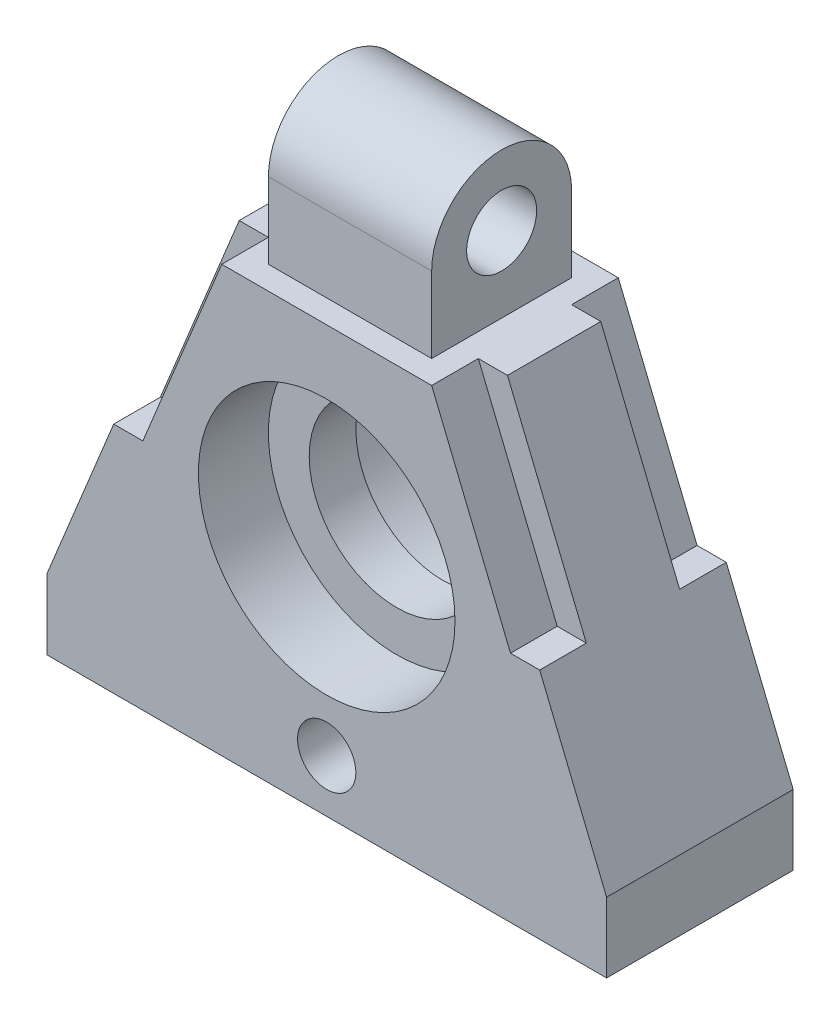
ISO-10303-21;
HEADER;
FILE_DESCRIPTION(('STEP AP214'),'2;1');
FILE_NAME('part.step','',(''),(''),'','','');
FILE_SCHEMA(('AUTOMOTIVE_DESIGN { 1 0 10303 214 1 1 1 1 }'));
ENDSEC;
DATA;
#1=APPLICATION_CONTEXT('core data for automotive mechanical design processes');
#2=APPLICATION_PROTOCOL_DEFINITION('international standard','automotive_design',2000,#1);
#3=PRODUCT_CONTEXT('',#1,'mechanical');
#4=PRODUCT('Part','Part','',(#3));
#5=PRODUCT_RELATED_PRODUCT_CATEGORY('part','',(#4));
#6=PRODUCT_DEFINITION_FORMATION('','',#4);
#7=PRODUCT_DEFINITION_CONTEXT('part definition',#1,'design');
#8=PRODUCT_DEFINITION('design','',#6,#7);
#9=PRODUCT_DEFINITION_SHAPE('','',#8);
#10=(LENGTH_UNIT() NAMED_UNIT(*) SI_UNIT(.MILLI.,.METRE.));
#11=(NAMED_UNIT(*) PLANE_ANGLE_UNIT() SI_UNIT($,.RADIAN.));
#12=(NAMED_UNIT(*) SI_UNIT($,.STERADIAN.) SOLID_ANGLE_UNIT());
#13=UNCERTAINTY_MEASURE_WITH_UNIT(LENGTH_MEASURE(1.E-05),#10,'distance_accuracy_value','');
#14=(GEOMETRIC_REPRESENTATION_CONTEXT(3) GLOBAL_UNCERTAINTY_ASSIGNED_CONTEXT((#13)) GLOBAL_UNIT_ASSIGNED_CONTEXT((#10,
#11,#12)) REPRESENTATION_CONTEXT('',''));
#15=CARTESIAN_POINT('',(0.,0.,0.));
#16=DIRECTION('',(0.,0.,1.));
#17=DIRECTION('',(1.,0.,0.));
#18=AXIS2_PLACEMENT_3D('',#15,#16,#17);
#19=CARTESIAN_POINT('',(-23.,73.,16.));
#20=DIRECTION('',(0.,-1.,0.));
#21=DIRECTION('',(0.,0.,-1.));
#22=AXIS2_PLACEMENT_3D('',#19,#20,#21);
#23=PLANE('',#22);
#24=DIRECTION('',(0.,0.,-1.));
#25=VECTOR('',#24,1.);
#26=CARTESIAN_POINT('',(-18.,73.,-8.));
#27=LINE('',#26,#25);
#28=CARTESIAN_POINT('',(-18.,73.,-8.));
#29=VERTEX_POINT('',#28);
#30=CARTESIAN_POINT('',(-18.,73.,-16.));
#31=VERTEX_POINT('',#30);
#32=EDGE_CURVE('E236',#29,#31,#27,.T.);
#33=ORIENTED_EDGE('',*,*,#32,.F.);
#34=DIRECTION('',(-1.,0.,0.));
#35=VECTOR('',#34,1.);
#36=CARTESIAN_POINT('',(-18.,73.,-8.));
#37=LINE('',#36,#35);
#38=CARTESIAN_POINT('',(-23.,73.,-8.));
#39=VERTEX_POINT('',#38);
#40=EDGE_CURVE('E228',#29,#39,#37,.T.);
#41=ORIENTED_EDGE('',*,*,#40,.T.);
#42=DIRECTION('',(0.,0.,-1.));
#43=VECTOR('',#42,1.);
#44=CARTESIAN_POINT('',(-23.,73.,16.));
#45=LINE('',#44,#43);
#46=CARTESIAN_POINT('',(-23.,73.,8.));
#47=VERTEX_POINT('',#46);
#48=EDGE_CURVE('E349',#47,#39,#45,.T.);
#49=ORIENTED_EDGE('',*,*,#48,.F.);
#50=DIRECTION('',(-1.,0.,0.));
#51=VECTOR('',#50,1.);
#52=CARTESIAN_POINT('',(-18.,73.,8.));
#53=LINE('',#52,#51);
#54=CARTESIAN_POINT('',(-18.,73.,8.));
#55=VERTEX_POINT('',#54);
#56=EDGE_CURVE('E277',#55,#47,#53,.T.);
#57=ORIENTED_EDGE('',*,*,#56,.F.);
#58=DIRECTION('',(0.,0.,1.));
#59=VECTOR('',#58,1.);
#60=CARTESIAN_POINT('',(-18.,73.,8.));
#61=LINE('',#60,#59);
#62=CARTESIAN_POINT('',(-18.,73.,16.));
#63=VERTEX_POINT('',#62);
#64=EDGE_CURVE('E285',#55,#63,#61,.T.);
#65=ORIENTED_EDGE('',*,*,#64,.T.);
#66=DIRECTION('',(-1.,0.,0.));
#67=VECTOR('',#66,1.);
#68=CARTESIAN_POINT('',(-23.,73.,16.));
#69=LINE('',#68,#67);
#70=CARTESIAN_POINT('',(18.,73.,16.));
#71=VERTEX_POINT('',#70);
#72=EDGE_CURVE('E346',#71,#63,#69,.T.);
#73=ORIENTED_EDGE('',*,*,#72,.F.);
#74=DIRECTION('',(0.,0.,1.));
#75=VECTOR('',#74,1.);
#76=CARTESIAN_POINT('',(18.,73.,8.));
#77=LINE('',#76,#75);
#78=CARTESIAN_POINT('',(18.,73.,8.));
#79=VERTEX_POINT('',#78);
#80=EDGE_CURVE('E308',#79,#71,#77,.T.);
#81=ORIENTED_EDGE('',*,*,#80,.F.);
#82=DIRECTION('',(-1.,0.,0.));
#83=VECTOR('',#82,1.);
#84=CARTESIAN_POINT('',(18.,73.,8.));
#85=LINE('',#84,#83);
#86=CARTESIAN_POINT('',(23.,73.,8.));
#87=VERTEX_POINT('',#86);
#88=EDGE_CURVE('E296',#87,#79,#85,.T.);
#89=ORIENTED_EDGE('',*,*,#88,.F.);
#90=DIRECTION('',(0.,0.,-1.));
#91=VECTOR('',#90,1.);
#92=CARTESIAN_POINT('',(23.,73.,16.));
#93=LINE('',#92,#91);
#94=CARTESIAN_POINT('',(23.,73.,-8.));
#95=VERTEX_POINT('',#94);
#96=EDGE_CURVE('E364',#87,#95,#93,.T.);
#97=ORIENTED_EDGE('',*,*,#96,.T.);
#98=DIRECTION('',(-1.,0.,0.));
#99=VECTOR('',#98,1.);
#100=CARTESIAN_POINT('',(18.,73.,-8.));
#101=LINE('',#100,#99);
#102=CARTESIAN_POINT('',(18.,73.,-8.));
#103=VERTEX_POINT('',#102);
#104=EDGE_CURVE('E243',#95,#103,#101,.T.);
#105=ORIENTED_EDGE('',*,*,#104,.T.);
#106=DIRECTION('',(0.,0.,-1.));
#107=VECTOR('',#106,1.);
#108=CARTESIAN_POINT('',(18.,73.,-8.));
#109=LINE('',#108,#107);
#110=CARTESIAN_POINT('',(18.,73.,-16.));
#111=VERTEX_POINT('',#110);
#112=EDGE_CURVE('E259',#103,#111,#109,.T.);
#113=ORIENTED_EDGE('',*,*,#112,.T.);
#114=DIRECTION('',(-1.,0.,0.));
#115=VECTOR('',#114,1.);
#116=CARTESIAN_POINT('',(-23.,73.,-16.));
#117=LINE('',#116,#115);
#118=EDGE_CURVE('E337',#111,#31,#117,.T.);
#119=ORIENTED_EDGE('',*,*,#118,.T.);
#120=EDGE_LOOP('',(#33,#41,#49,#57,#65,#73,#81,#89,#97,#105,#113,#119));
#121=FACE_BOUND('',#120,.T.);
#122=DIRECTION('',(-1.,0.,0.));
#123=VECTOR('',#122,1.);
#124=CARTESIAN_POINT('',(14.,73.,12.));
#125=LINE('',#124,#123);
#126=CARTESIAN_POINT('',(14.,73.,12.));
#127=VERTEX_POINT('',#126);
#128=CARTESIAN_POINT('',(-14.,73.,12.));
#129=VERTEX_POINT('',#128);
#130=EDGE_CURVE('E52',#127,#129,#125,.T.);
#131=ORIENTED_EDGE('',*,*,#130,.T.);
#132=DIRECTION('',(0.,0.,-1.));
#133=VECTOR('',#132,1.);
#134=CARTESIAN_POINT('',(-14.,73.,12.));
#135=LINE('',#134,#133);
#136=CARTESIAN_POINT('',(-14.,73.,-12.));
#137=VERTEX_POINT('',#136);
#138=EDGE_CURVE('E209',#129,#137,#135,.T.);
#139=ORIENTED_EDGE('',*,*,#138,.T.);
#140=DIRECTION('',(-1.,0.,0.));
#141=VECTOR('',#140,1.);
#142=CARTESIAN_POINT('',(14.,73.,-12.));
#143=LINE('',#142,#141);
#144=CARTESIAN_POINT('',(14.,73.,-12.));
#145=VERTEX_POINT('',#144);
#146=EDGE_CURVE('E196',#145,#137,#143,.T.);
#147=ORIENTED_EDGE('',*,*,#146,.F.);
#148=DIRECTION('',(0.,0.,-1.));
#149=VECTOR('',#148,1.);
#150=CARTESIAN_POINT('',(14.,73.,12.));
#151=LINE('',#150,#149);
#152=EDGE_CURVE('E47',#127,#145,#151,.T.);
#153=ORIENTED_EDGE('',*,*,#152,.F.);
#154=EDGE_LOOP('',(#131,#139,#147,#153));
#155=FACE_BOUND('',#154,.T.);
#156=ADVANCED_FACE('F32',(#121,#155),#23,.F.);
#157=CARTESIAN_POINT('',(0.,0.,-16.));
#158=DIRECTION('',(0.,0.,-1.));
#159=DIRECTION('',(-1.,0.,0.));
#160=AXIS2_PLACEMENT_3D('',#157,#158,#159);
#161=PLANE('',#160);
#162=CARTESIAN_POINT('',(0.,8.99999999999999,-16.));
#163=DIRECTION('',(0.,0.,1.));
#164=DIRECTION('',(1.,0.,0.));
#165=AXIS2_PLACEMENT_3D('',#162,#163,#164);
#166=CIRCLE('',#165,5.00000000000002);
#167=CARTESIAN_POINT('',(5.00000000000002,8.99999999999999,-16.));
#168=VERTEX_POINT('',#167);
#169=EDGE_CURVE('E325',#168,#168,#166,.T.);
#170=ORIENTED_EDGE('',*,*,#169,.T.);
#171=EDGE_LOOP('',(#170));
#172=FACE_BOUND('',#171,.T.);
#173=CARTESIAN_POINT('',(0.,40.,-16.));
#174=DIRECTION('',(0.,0.,1.));
#175=DIRECTION('',(1.,0.,0.));
#176=AXIS2_PLACEMENT_3D('',#173,#174,#175);
#177=CIRCLE('',#176,22.);
#178=CARTESIAN_POINT('',(22.,40.,-16.));
#179=VERTEX_POINT('',#178);
#180=EDGE_CURVE('E268',#179,#179,#177,.T.);
#181=ORIENTED_EDGE('',*,*,#180,.T.);
#182=EDGE_LOOP('',(#181));
#183=FACE_BOUND('',#182,.T.);
#184=DIRECTION('',(1.,0.,0.));
#185=VECTOR('',#184,1.);
#186=CARTESIAN_POINT('',(-36.5245901639344,40.,-16.));
#187=LINE('',#186,#185);
#188=CARTESIAN_POINT('',(-36.5245901639344,40.,-16.));
#189=VERTEX_POINT('',#188);
#190=CARTESIAN_POINT('',(-31.5245901639344,40.,-16.));
#191=VERTEX_POINT('',#190);
#192=EDGE_CURVE('E223',#189,#191,#187,.T.);
#193=ORIENTED_EDGE('',*,*,#192,.T.);
#194=DIRECTION('',(0.379223417483882,0.925305138660672,0.));
#195=VECTOR('',#194,1.);
#196=CARTESIAN_POINT('',(-31.5245901639344,40.,-16.));
#197=LINE('',#196,#195);
#198=EDGE_CURVE('E218',#191,#31,#197,.T.);
#199=ORIENTED_EDGE('',*,*,#198,.T.);
#200=ORIENTED_EDGE('',*,*,#118,.F.);
#201=DIRECTION('',(0.379223417483882,-0.925305138660672,0.));
#202=VECTOR('',#201,1.);
#203=CARTESIAN_POINT('',(31.5245901639344,40.,-16.));
#204=LINE('',#203,#202);
#205=CARTESIAN_POINT('',(31.5245901639344,40.,-16.));
#206=VERTEX_POINT('',#205);
#207=EDGE_CURVE('E247',#111,#206,#204,.T.);
#208=ORIENTED_EDGE('',*,*,#207,.T.);
#209=DIRECTION('',(1.,0.,0.));
#210=VECTOR('',#209,1.);
#211=CARTESIAN_POINT('',(36.5245901639344,40.,-16.));
#212=LINE('',#211,#210);
#213=CARTESIAN_POINT('',(36.5245901639344,40.,-16.));
#214=VERTEX_POINT('',#213);
#215=EDGE_CURVE('E238',#206,#214,#212,.T.);
#216=ORIENTED_EDGE('',*,*,#215,.T.);
#217=DIRECTION('',(-0.379223417483882,0.925305138660672,0.));
#218=VECTOR('',#217,1.);
#219=CARTESIAN_POINT('',(23.,73.,-16.));
#220=LINE('',#219,#218);
#221=CARTESIAN_POINT('',(48.,12.,-16.));
#222=VERTEX_POINT('',#221);
#223=EDGE_CURVE('E357',#222,#214,#220,.T.);
#224=ORIENTED_EDGE('',*,*,#223,.F.);
#225=DIRECTION('',(0.,1.,0.));
#226=VECTOR('',#225,1.);
#227=CARTESIAN_POINT('',(48.,12.,-16.));
#228=LINE('',#227,#226);
#229=CARTESIAN_POINT('',(48.,0.,-16.));
#230=VERTEX_POINT('',#229);
#231=EDGE_CURVE('E355',#230,#222,#228,.T.);
#232=ORIENTED_EDGE('',*,*,#231,.F.);
#233=DIRECTION('',(1.,0.,0.));
#234=VECTOR('',#233,1.);
#235=CARTESIAN_POINT('',(48.,0.,-16.));
#236=LINE('',#235,#234);
#237=CARTESIAN_POINT('',(-48.,0.,-16.));
#238=VERTEX_POINT('',#237);
#239=EDGE_CURVE('E353',#238,#230,#236,.T.);
#240=ORIENTED_EDGE('',*,*,#239,.F.);
#241=DIRECTION('',(0.,-1.,0.));
#242=VECTOR('',#241,1.);
#243=CARTESIAN_POINT('',(-48.,0.,-16.));
#244=LINE('',#243,#242);
#245=CARTESIAN_POINT('',(-48.,12.,-16.));
#246=VERTEX_POINT('',#245);
#247=EDGE_CURVE('E351',#246,#238,#244,.T.);
#248=ORIENTED_EDGE('',*,*,#247,.F.);
#249=DIRECTION('',(-0.379223417483882,-0.925305138660672,0.));
#250=VECTOR('',#249,1.);
#251=CARTESIAN_POINT('',(-48.,12.,-16.));
#252=LINE('',#251,#250);
#253=EDGE_CURVE('E331',#189,#246,#252,.T.);
#254=ORIENTED_EDGE('',*,*,#253,.F.);
#255=EDGE_LOOP('',(#193,#199,#200,#208,#216,#224,#232,#240,#248,#254));
#256=FACE_BOUND('',#255,.T.);
#257=ADVANCED_FACE('F384',(#172,#183,#256),#161,.T.);
#258=CARTESIAN_POINT('',(-48.,12.,16.));
#259=DIRECTION('',(0.925305138660672,-0.379223417483882,0.));
#260=DIRECTION('',(0.379223417483882,0.925305138660672,0.));
#261=AXIS2_PLACEMENT_3D('',#258,#259,#260);
#262=PLANE('',#261);
#263=DIRECTION('',(0.,0.,-1.));
#264=VECTOR('',#263,1.);
#265=CARTESIAN_POINT('',(-36.5245901639344,40.,-8.));
#266=LINE('',#265,#264);
#267=CARTESIAN_POINT('',(-36.5245901639344,40.,-8.));
#268=VERTEX_POINT('',#267);
#269=EDGE_CURVE('E239',#268,#189,#266,.T.);
#270=ORIENTED_EDGE('',*,*,#269,.T.);
#271=ORIENTED_EDGE('',*,*,#253,.T.);
#272=DIRECTION('',(0.,0.,-1.));
#273=VECTOR('',#272,1.);
#274=CARTESIAN_POINT('',(-48.,12.,16.));
#275=LINE('',#274,#273);
#276=CARTESIAN_POINT('',(-48.,12.,16.));
#277=VERTEX_POINT('',#276);
#278=EDGE_CURVE('E11',#277,#246,#275,.T.);
#279=ORIENTED_EDGE('',*,*,#278,.F.);
#280=DIRECTION('',(-0.379223417483882,-0.925305138660672,0.));
#281=VECTOR('',#280,1.);
#282=CARTESIAN_POINT('',(-48.,12.,16.));
#283=LINE('',#282,#281);
#284=CARTESIAN_POINT('',(-36.5245901639344,40.,16.));
#285=VERTEX_POINT('',#284);
#286=EDGE_CURVE('E334',#285,#277,#283,.T.);
#287=ORIENTED_EDGE('',*,*,#286,.F.);
#288=DIRECTION('',(0.,0.,1.));
#289=VECTOR('',#288,1.);
#290=CARTESIAN_POINT('',(-36.5245901639344,40.,8.));
#291=LINE('',#290,#289);
#292=CARTESIAN_POINT('',(-36.5245901639344,40.,8.));
#293=VERTEX_POINT('',#292);
#294=EDGE_CURVE('E292',#293,#285,#291,.T.);
#295=ORIENTED_EDGE('',*,*,#294,.F.);
#296=DIRECTION('',(-0.379223417483882,-0.925305138660672,0.));
#297=VECTOR('',#296,1.);
#298=CARTESIAN_POINT('',(-23.,73.,8.));
#299=LINE('',#298,#297);
#300=EDGE_CURVE('E280',#47,#293,#299,.T.);
#301=ORIENTED_EDGE('',*,*,#300,.F.);
#302=ORIENTED_EDGE('',*,*,#48,.T.);
#303=DIRECTION('',(-0.379223417483882,-0.925305138660672,0.));
#304=VECTOR('',#303,1.);
#305=CARTESIAN_POINT('',(-23.,73.,-8.));
#306=LINE('',#305,#304);
#307=EDGE_CURVE('E225',#39,#268,#306,.T.);
#308=ORIENTED_EDGE('',*,*,#307,.T.);
#309=EDGE_LOOP('',(#270,#271,#279,#287,#295,#301,#302,#308));
#310=FACE_BOUND('',#309,.T.);
#311=ADVANCED_FACE('F34',(#310),#262,.F.);
#312=CARTESIAN_POINT('',(23.,73.,16.));
#313=DIRECTION('',(-0.925305138660672,-0.379223417483882,0.));
#314=DIRECTION('',(0.379223417483882,-0.925305138660672,0.));
#315=AXIS2_PLACEMENT_3D('',#312,#313,#314);
#316=PLANE('',#315);
#317=DIRECTION('',(0.,0.,-1.));
#318=VECTOR('',#317,1.);
#319=CARTESIAN_POINT('',(36.5245901639344,40.,-8.));
#320=LINE('',#319,#318);
#321=CARTESIAN_POINT('',(36.5245901639344,40.,-8.));
#322=VERTEX_POINT('',#321);
#323=EDGE_CURVE('E254',#322,#214,#320,.T.);
#324=ORIENTED_EDGE('',*,*,#323,.F.);
#325=DIRECTION('',(-0.379223417483882,0.925305138660672,0.));
#326=VECTOR('',#325,1.);
#327=CARTESIAN_POINT('',(23.,73.,-8.));
#328=LINE('',#327,#326);
#329=EDGE_CURVE('E246',#322,#95,#328,.T.);
#330=ORIENTED_EDGE('',*,*,#329,.T.);
#331=ORIENTED_EDGE('',*,*,#96,.F.);
#332=DIRECTION('',(-0.379223417483882,0.925305138660672,0.));
#333=VECTOR('',#332,1.);
#334=CARTESIAN_POINT('',(23.,73.,8.));
#335=LINE('',#334,#333);
#336=CARTESIAN_POINT('',(36.5245901639344,40.,8.));
#337=VERTEX_POINT('',#336);
#338=EDGE_CURVE('E306',#337,#87,#335,.T.);
#339=ORIENTED_EDGE('',*,*,#338,.F.);
#340=DIRECTION('',(0.,0.,1.));
#341=VECTOR('',#340,1.);
#342=CARTESIAN_POINT('',(36.5245901639344,40.,8.));
#343=LINE('',#342,#341);
#344=CARTESIAN_POINT('',(36.5245901639344,40.,16.));
#345=VERTEX_POINT('',#344);
#346=EDGE_CURVE('E312',#337,#345,#343,.T.);
#347=ORIENTED_EDGE('',*,*,#346,.T.);
#348=DIRECTION('',(-0.379223417483882,0.925305138660672,0.));
#349=VECTOR('',#348,1.);
#350=CARTESIAN_POINT('',(23.,73.,16.));
#351=LINE('',#350,#349);
#352=CARTESIAN_POINT('',(48.,12.,16.));
#353=VERTEX_POINT('',#352);
#354=EDGE_CURVE('E343',#353,#345,#351,.T.);
#355=ORIENTED_EDGE('',*,*,#354,.F.);
#356=DIRECTION('',(0.,0.,-1.));
#357=VECTOR('',#356,1.);
#358=CARTESIAN_POINT('',(48.,12.,16.));
#359=LINE('',#358,#357);
#360=EDGE_CURVE('E367',#353,#222,#359,.T.);
#361=ORIENTED_EDGE('',*,*,#360,.T.);
#362=ORIENTED_EDGE('',*,*,#223,.T.);
#363=EDGE_LOOP('',(#324,#330,#331,#339,#347,#355,#361,#362));
#364=FACE_BOUND('',#363,.T.);
#365=ADVANCED_FACE('F394',(#364),#316,.F.);
#366=CARTESIAN_POINT('',(0.,40.,16.));
#367=DIRECTION('',(0.,0.,-1.));
#368=DIRECTION('',(-1.,0.,0.));
#369=AXIS2_PLACEMENT_3D('',#366,#367,#368);
#370=CYLINDRICAL_SURFACE('',#369,15.);
#371=CARTESIAN_POINT('',(0.,40.,4.));
#372=DIRECTION('',(0.,0.,1.));
#373=DIRECTION('',(1.,0.,0.));
#374=AXIS2_PLACEMENT_3D('',#371,#372,#373);
#375=CIRCLE('',#374,15.);
#376=CARTESIAN_POINT('',(15.,40.,4.));
#377=VERTEX_POINT('',#376);
#378=EDGE_CURVE('E315',#377,#377,#375,.T.);
#379=ORIENTED_EDGE('',*,*,#378,.T.);
#380=EDGE_LOOP('',(#379));
#381=FACE_BOUND('',#380,.T.);
#382=CARTESIAN_POINT('',(0.,40.,-4.));
#383=DIRECTION('',(0.,0.,1.));
#384=DIRECTION('',(1.,0.,0.));
#385=AXIS2_PLACEMENT_3D('',#382,#383,#384);
#386=CIRCLE('',#385,15.);
#387=CARTESIAN_POINT('',(15.,40.,-4.));
#388=VERTEX_POINT('',#387);
#389=EDGE_CURVE('E262',#388,#388,#386,.T.);
#390=ORIENTED_EDGE('',*,*,#389,.F.);
#391=EDGE_LOOP('',(#390));
#392=FACE_BOUND('',#391,.T.);
#393=ADVANCED_FACE('F475',(#381,#392),#370,.F.);
#394=CARTESIAN_POINT('',(0.,0.,16.));
#395=DIRECTION('',(0.,0.,-1.));
#396=DIRECTION('',(-1.,0.,0.));
#397=AXIS2_PLACEMENT_3D('',#394,#395,#396);
#398=PLANE('',#397);
#399=CARTESIAN_POINT('',(0.,40.,16.));
#400=DIRECTION('',(0.,0.,1.));
#401=DIRECTION('',(1.,0.,0.));
#402=AXIS2_PLACEMENT_3D('',#399,#400,#401);
#403=CIRCLE('',#402,22.);
#404=CARTESIAN_POINT('',(22.,40.,16.));
#405=VERTEX_POINT('',#404);
#406=EDGE_CURVE('E321',#405,#405,#403,.T.);
#407=ORIENTED_EDGE('',*,*,#406,.F.);
#408=EDGE_LOOP('',(#407));
#409=FACE_BOUND('',#408,.T.);
#410=ORIENTED_EDGE('',*,*,#72,.T.);
#411=DIRECTION('',(0.379223417483882,0.925305138660672,0.));
#412=VECTOR('',#411,1.);
#413=CARTESIAN_POINT('',(-31.5245901639344,40.,16.));
#414=LINE('',#413,#412);
#415=CARTESIAN_POINT('',(-31.5245901639344,40.,16.));
#416=VERTEX_POINT('',#415);
#417=EDGE_CURVE('E272',#416,#63,#414,.T.);
#418=ORIENTED_EDGE('',*,*,#417,.F.);
#419=DIRECTION('',(1.,0.,0.));
#420=VECTOR('',#419,1.);
#421=CARTESIAN_POINT('',(-36.5245901639344,40.,16.));
#422=LINE('',#421,#420);
#423=EDGE_CURVE('E278',#285,#416,#422,.T.);
#424=ORIENTED_EDGE('',*,*,#423,.F.);
#425=ORIENTED_EDGE('',*,*,#286,.T.);
#426=DIRECTION('',(0.,-1.,0.));
#427=VECTOR('',#426,1.);
#428=CARTESIAN_POINT('',(-48.,0.,16.));
#429=LINE('',#428,#427);
#430=CARTESIAN_POINT('',(-48.,0.,16.));
#431=VERTEX_POINT('',#430);
#432=EDGE_CURVE('E336',#277,#431,#429,.T.);
#433=ORIENTED_EDGE('',*,*,#432,.T.);
#434=DIRECTION('',(1.,0.,0.));
#435=VECTOR('',#434,1.);
#436=CARTESIAN_POINT('',(48.,0.,16.));
#437=LINE('',#436,#435);
#438=CARTESIAN_POINT('',(48.,0.,16.));
#439=VERTEX_POINT('',#438);
#440=EDGE_CURVE('E339',#431,#439,#437,.T.);
#441=ORIENTED_EDGE('',*,*,#440,.T.);
#442=DIRECTION('',(0.,1.,0.));
#443=VECTOR('',#442,1.);
#444=CARTESIAN_POINT('',(48.,12.,16.));
#445=LINE('',#444,#443);
#446=EDGE_CURVE('E341',#439,#353,#445,.T.);
#447=ORIENTED_EDGE('',*,*,#446,.T.);
#448=ORIENTED_EDGE('',*,*,#354,.T.);
#449=DIRECTION('',(1.,0.,0.));
#450=VECTOR('',#449,1.);
#451=CARTESIAN_POINT('',(36.5245901639344,40.,16.));
#452=LINE('',#451,#450);
#453=CARTESIAN_POINT('',(31.5245901639344,40.,16.));
#454=VERTEX_POINT('',#453);
#455=EDGE_CURVE('E300',#454,#345,#452,.T.);
#456=ORIENTED_EDGE('',*,*,#455,.F.);
#457=DIRECTION('',(0.379223417483882,-0.925305138660672,0.));
#458=VECTOR('',#457,1.);
#459=CARTESIAN_POINT('',(31.5245901639344,40.,16.));
#460=LINE('',#459,#458);
#461=EDGE_CURVE('E291',#71,#454,#460,.T.);
#462=ORIENTED_EDGE('',*,*,#461,.F.);
#463=EDGE_LOOP('',(#410,#418,#424,#425,#433,#441,#447,#448,#456,#462));
#464=FACE_BOUND('',#463,.T.);
#465=CARTESIAN_POINT('',(0.,8.99999999999999,16.));
#466=DIRECTION('',(0.,0.,1.));
#467=DIRECTION('',(1.,0.,0.));
#468=AXIS2_PLACEMENT_3D('',#465,#466,#467);
#469=CIRCLE('',#468,5.00000000000002);
#470=CARTESIAN_POINT('',(5.00000000000002,8.99999999999999,16.));
#471=VERTEX_POINT('',#470);
#472=EDGE_CURVE('E328',#471,#471,#469,.T.);
#473=ORIENTED_EDGE('',*,*,#472,.F.);
#474=EDGE_LOOP('',(#473));
#475=FACE_BOUND('',#474,.T.);
#476=ADVANCED_FACE('F398',(#409,#464,#475),#398,.F.);
#477=CARTESIAN_POINT('',(-48.,0.,16.));
#478=DIRECTION('',(1.,0.,0.));
#479=DIRECTION('',(0.,0.,-1.));
#480=AXIS2_PLACEMENT_3D('',#477,#478,#479);
#481=PLANE('',#480);
#482=ORIENTED_EDGE('',*,*,#247,.T.);
#483=DIRECTION('',(0.,0.,-1.));
#484=VECTOR('',#483,1.);
#485=CARTESIAN_POINT('',(-48.,0.,16.));
#486=LINE('',#485,#484);
#487=EDGE_CURVE('E40',#431,#238,#486,.T.);
#488=ORIENTED_EDGE('',*,*,#487,.F.);
#489=ORIENTED_EDGE('',*,*,#432,.F.);
#490=ORIENTED_EDGE('',*,*,#278,.T.);
#491=EDGE_LOOP('',(#482,#488,#489,#490));
#492=FACE_BOUND('',#491,.T.);
#493=ADVANCED_FACE('F404',(#492),#481,.F.);
#494=CARTESIAN_POINT('',(48.,0.,16.));
#495=DIRECTION('',(0.,1.,0.));
#496=DIRECTION('',(0.,0.,1.));
#497=AXIS2_PLACEMENT_3D('',#494,#495,#496);
#498=PLANE('',#497);
#499=ORIENTED_EDGE('',*,*,#239,.T.);
#500=DIRECTION('',(0.,0.,-1.));
#501=VECTOR('',#500,1.);
#502=CARTESIAN_POINT('',(48.,0.,16.));
#503=LINE('',#502,#501);
#504=EDGE_CURVE('E370',#439,#230,#503,.T.);
#505=ORIENTED_EDGE('',*,*,#504,.F.);
#506=ORIENTED_EDGE('',*,*,#440,.F.);
#507=ORIENTED_EDGE('',*,*,#487,.T.);
#508=EDGE_LOOP('',(#499,#505,#506,#507));
#509=FACE_BOUND('',#508,.T.);
#510=ADVANCED_FACE('F377',(#509),#498,.F.);
#511=CARTESIAN_POINT('',(48.,12.,16.));
#512=DIRECTION('',(-1.,0.,0.));
#513=DIRECTION('',(0.,0.,1.));
#514=AXIS2_PLACEMENT_3D('',#511,#512,#513);
#515=PLANE('',#514);
#516=ORIENTED_EDGE('',*,*,#231,.T.);
#517=ORIENTED_EDGE('',*,*,#360,.F.);
#518=ORIENTED_EDGE('',*,*,#446,.F.);
#519=ORIENTED_EDGE('',*,*,#504,.T.);
#520=EDGE_LOOP('',(#516,#517,#518,#519));
#521=FACE_BOUND('',#520,.T.);
#522=ADVANCED_FACE('F389',(#521),#515,.F.);
#523=CARTESIAN_POINT('',(0.,8.99999999999999,16.));
#524=DIRECTION('',(0.,0.,-1.));
#525=DIRECTION('',(-1.,0.,0.));
#526=AXIS2_PLACEMENT_3D('',#523,#524,#525);
#527=CYLINDRICAL_SURFACE('',#526,5.00000000000002);
#528=ORIENTED_EDGE('',*,*,#472,.T.);
#529=EDGE_LOOP('',(#528));
#530=FACE_BOUND('',#529,.T.);
#531=ORIENTED_EDGE('',*,*,#169,.F.);
#532=EDGE_LOOP('',(#531));
#533=FACE_BOUND('',#532,.T.);
#534=ADVANCED_FACE('F478',(#530,#533),#527,.F.);
#535=CARTESIAN_POINT('',(0.,40.,4.));
#536=DIRECTION('',(0.,0.,1.));
#537=DIRECTION('',(1.,0.,0.));
#538=AXIS2_PLACEMENT_3D('',#535,#536,#537);
#539=CYLINDRICAL_SURFACE('',#538,22.);
#540=CARTESIAN_POINT('',(0.,40.,4.));
#541=DIRECTION('',(0.,0.,1.));
#542=DIRECTION('',(1.,0.,0.));
#543=AXIS2_PLACEMENT_3D('',#540,#541,#542);
#544=CIRCLE('',#543,22.);
#545=CARTESIAN_POINT('',(22.,40.,4.));
#546=VERTEX_POINT('',#545);
#547=EDGE_CURVE('E322',#546,#546,#544,.T.);
#548=ORIENTED_EDGE('',*,*,#547,.F.);
#549=EDGE_LOOP('',(#548));
#550=FACE_BOUND('',#549,.T.);
#551=ORIENTED_EDGE('',*,*,#406,.T.);
#552=EDGE_LOOP('',(#551));
#553=FACE_BOUND('',#552,.T.);
#554=ADVANCED_FACE('F494',(#550,#553),#539,.F.);
#555=CARTESIAN_POINT('',(0.,40.,4.));
#556=DIRECTION('',(0.,0.,1.));
#557=DIRECTION('',(1.,0.,0.));
#558=AXIS2_PLACEMENT_3D('',#555,#556,#557);
#559=PLANE('',#558);
#560=ORIENTED_EDGE('',*,*,#378,.F.);
#561=EDGE_LOOP('',(#560));
#562=FACE_BOUND('',#561,.T.);
#563=ORIENTED_EDGE('',*,*,#547,.T.);
#564=EDGE_LOOP('',(#563));
#565=FACE_BOUND('',#564,.T.);
#566=ADVANCED_FACE('F498',(#562,#565),#559,.T.);
#567=CARTESIAN_POINT('',(36.5245901639344,40.,8.));
#568=DIRECTION('',(0.,-1.,0.));
#569=DIRECTION('',(0.,0.,-1.));
#570=AXIS2_PLACEMENT_3D('',#567,#568,#569);
#571=PLANE('',#570);
#572=ORIENTED_EDGE('',*,*,#455,.T.);
#573=ORIENTED_EDGE('',*,*,#346,.F.);
#574=DIRECTION('',(1.,0.,0.));
#575=VECTOR('',#574,1.);
#576=CARTESIAN_POINT('',(36.5245901639344,40.,8.));
#577=LINE('',#576,#575);
#578=CARTESIAN_POINT('',(31.5245901639344,40.,8.));
#579=VERTEX_POINT('',#578);
#580=EDGE_CURVE('E303',#579,#337,#577,.T.);
#581=ORIENTED_EDGE('',*,*,#580,.F.);
#582=DIRECTION('',(0.,0.,1.));
#583=VECTOR('',#582,1.);
#584=CARTESIAN_POINT('',(31.5245901639344,40.,8.));
#585=LINE('',#584,#583);
#586=EDGE_CURVE('E316',#579,#454,#585,.T.);
#587=ORIENTED_EDGE('',*,*,#586,.T.);
#588=EDGE_LOOP('',(#572,#573,#581,#587));
#589=FACE_BOUND('',#588,.T.);
#590=ADVANCED_FACE('F437',(#589),#571,.F.);
#591=CARTESIAN_POINT('',(31.5245901639344,40.,8.));
#592=DIRECTION('',(-0.925305138660672,-0.379223417483882,0.));
#593=DIRECTION('',(0.379223417483882,-0.925305138660672,0.));
#594=AXIS2_PLACEMENT_3D('',#591,#592,#593);
#595=PLANE('',#594);
#596=ORIENTED_EDGE('',*,*,#461,.T.);
#597=ORIENTED_EDGE('',*,*,#586,.F.);
#598=DIRECTION('',(0.379223417483882,-0.925305138660672,0.));
#599=VECTOR('',#598,1.);
#600=CARTESIAN_POINT('',(31.5245901639344,40.,8.));
#601=LINE('',#600,#599);
#602=EDGE_CURVE('E299',#79,#579,#601,.T.);
#603=ORIENTED_EDGE('',*,*,#602,.F.);
#604=ORIENTED_EDGE('',*,*,#80,.T.);
#605=EDGE_LOOP('',(#596,#597,#603,#604));
#606=FACE_BOUND('',#605,.T.);
#607=ADVANCED_FACE('F439',(#606),#595,.F.);
#608=CARTESIAN_POINT('',(0.,0.,8.));
#609=DIRECTION('',(0.,0.,-1.));
#610=DIRECTION('',(-1.,0.,0.));
#611=AXIS2_PLACEMENT_3D('',#608,#609,#610);
#612=PLANE('',#611);
#613=ORIENTED_EDGE('',*,*,#88,.T.);
#614=ORIENTED_EDGE('',*,*,#602,.T.);
#615=ORIENTED_EDGE('',*,*,#580,.T.);
#616=ORIENTED_EDGE('',*,*,#338,.T.);
#617=EDGE_LOOP('',(#613,#614,#615,#616));
#618=FACE_BOUND('',#617,.T.);
#619=ADVANCED_FACE('F434',(#618),#612,.F.);
#620=CARTESIAN_POINT('',(-31.5245901639344,40.,8.));
#621=DIRECTION('',(0.925305138660672,-0.379223417483882,0.));
#622=DIRECTION('',(0.379223417483882,0.925305138660672,0.));
#623=AXIS2_PLACEMENT_3D('',#620,#621,#622);
#624=PLANE('',#623);
#625=ORIENTED_EDGE('',*,*,#417,.T.);
#626=ORIENTED_EDGE('',*,*,#64,.F.);
#627=DIRECTION('',(0.379223417483882,0.925305138660672,0.));
#628=VECTOR('',#627,1.);
#629=CARTESIAN_POINT('',(-31.5245901639344,40.,8.));
#630=LINE('',#629,#628);
#631=CARTESIAN_POINT('',(-31.5245901639344,40.,8.));
#632=VERTEX_POINT('',#631);
#633=EDGE_CURVE('E275',#632,#55,#630,.T.);
#634=ORIENTED_EDGE('',*,*,#633,.F.);
#635=DIRECTION('',(0.,0.,1.));
#636=VECTOR('',#635,1.);
#637=CARTESIAN_POINT('',(-31.5245901639344,40.,8.));
#638=LINE('',#637,#636);
#639=EDGE_CURVE('E289',#632,#416,#638,.T.);
#640=ORIENTED_EDGE('',*,*,#639,.T.);
#641=EDGE_LOOP('',(#625,#626,#634,#640));
#642=FACE_BOUND('',#641,.T.);
#643=ADVANCED_FACE('F445',(#642),#624,.F.);
#644=CARTESIAN_POINT('',(-36.5245901639344,40.,8.));
#645=DIRECTION('',(0.,-1.,0.));
#646=DIRECTION('',(0.,0.,-1.));
#647=AXIS2_PLACEMENT_3D('',#644,#645,#646);
#648=PLANE('',#647);
#649=ORIENTED_EDGE('',*,*,#423,.T.);
#650=ORIENTED_EDGE('',*,*,#639,.F.);
#651=DIRECTION('',(1.,0.,0.));
#652=VECTOR('',#651,1.);
#653=CARTESIAN_POINT('',(-36.5245901639344,40.,8.));
#654=LINE('',#653,#652);
#655=EDGE_CURVE('E282',#293,#632,#654,.T.);
#656=ORIENTED_EDGE('',*,*,#655,.F.);
#657=ORIENTED_EDGE('',*,*,#294,.T.);
#658=EDGE_LOOP('',(#649,#650,#656,#657));
#659=FACE_BOUND('',#658,.T.);
#660=ADVANCED_FACE('F447',(#659),#648,.F.);
#661=CARTESIAN_POINT('',(0.,0.,8.));
#662=DIRECTION('',(0.,0.,1.));
#663=DIRECTION('',(1.,0.,0.));
#664=AXIS2_PLACEMENT_3D('',#661,#662,#663);
#665=PLANE('',#664);
#666=ORIENTED_EDGE('',*,*,#633,.T.);
#667=ORIENTED_EDGE('',*,*,#56,.T.);
#668=ORIENTED_EDGE('',*,*,#300,.T.);
#669=ORIENTED_EDGE('',*,*,#655,.T.);
#670=EDGE_LOOP('',(#666,#667,#668,#669));
#671=FACE_BOUND('',#670,.T.);
#672=ADVANCED_FACE('F451',(#671),#665,.T.);
#673=CARTESIAN_POINT('',(0.,40.,-4.));
#674=DIRECTION('',(0.,0.,-1.));
#675=DIRECTION('',(1.,0.,0.));
#676=AXIS2_PLACEMENT_3D('',#673,#674,#675);
#677=PLANE('',#676);
#678=CARTESIAN_POINT('',(0.,40.,-4.));
#679=DIRECTION('',(0.,0.,1.));
#680=DIRECTION('',(1.,0.,0.));
#681=AXIS2_PLACEMENT_3D('',#678,#679,#680);
#682=CIRCLE('',#681,22.);
#683=CARTESIAN_POINT('',(22.,40.,-4.));
#684=VERTEX_POINT('',#683);
#685=EDGE_CURVE('E269',#684,#684,#682,.T.);
#686=ORIENTED_EDGE('',*,*,#685,.F.);
#687=EDGE_LOOP('',(#686));
#688=FACE_BOUND('',#687,.T.);
#689=ORIENTED_EDGE('',*,*,#389,.T.);
#690=EDGE_LOOP('',(#689));
#691=FACE_BOUND('',#690,.T.);
#692=ADVANCED_FACE('F453',(#688,#691),#677,.T.);
#693=CARTESIAN_POINT('',(0.,40.,-4.));
#694=DIRECTION('',(0.,0.,-1.));
#695=DIRECTION('',(-1.,0.,0.));
#696=AXIS2_PLACEMENT_3D('',#693,#694,#695);
#697=CYLINDRICAL_SURFACE('',#696,22.);
#698=ORIENTED_EDGE('',*,*,#685,.T.);
#699=EDGE_LOOP('',(#698));
#700=FACE_BOUND('',#699,.T.);
#701=ORIENTED_EDGE('',*,*,#180,.F.);
#702=EDGE_LOOP('',(#701));
#703=FACE_BOUND('',#702,.T.);
#704=ADVANCED_FACE('F459',(#700,#703),#697,.F.);
#705=CARTESIAN_POINT('',(31.5245901639344,40.,-8.));
#706=DIRECTION('',(0.925305138660672,0.379223417483882,0.));
#707=DIRECTION('',(-0.379223417483882,0.925305138660672,0.));
#708=AXIS2_PLACEMENT_3D('',#705,#706,#707);
#709=PLANE('',#708);
#710=ORIENTED_EDGE('',*,*,#207,.F.);
#711=ORIENTED_EDGE('',*,*,#112,.F.);
#712=DIRECTION('',(0.379223417483882,-0.925305138660672,0.));
#713=VECTOR('',#712,1.);
#714=CARTESIAN_POINT('',(31.5245901639344,40.,-8.));
#715=LINE('',#714,#713);
#716=CARTESIAN_POINT('',(31.5245901639344,40.,-8.));
#717=VERTEX_POINT('',#716);
#718=EDGE_CURVE('E252',#103,#717,#715,.T.);
#719=ORIENTED_EDGE('',*,*,#718,.T.);
#720=DIRECTION('',(0.,0.,-1.));
#721=VECTOR('',#720,1.);
#722=CARTESIAN_POINT('',(31.5245901639344,40.,-8.));
#723=LINE('',#722,#721);
#724=EDGE_CURVE('E263',#717,#206,#723,.T.);
#725=ORIENTED_EDGE('',*,*,#724,.T.);
#726=EDGE_LOOP('',(#710,#711,#719,#725));
#727=FACE_BOUND('',#726,.T.);
#728=ADVANCED_FACE('F421',(#727),#709,.T.);
#729=CARTESIAN_POINT('',(36.5245901639344,40.,-8.));
#730=DIRECTION('',(0.,1.,0.));
#731=DIRECTION('',(0.,0.,1.));
#732=AXIS2_PLACEMENT_3D('',#729,#730,#731);
#733=PLANE('',#732);
#734=ORIENTED_EDGE('',*,*,#215,.F.);
#735=ORIENTED_EDGE('',*,*,#724,.F.);
#736=DIRECTION('',(1.,0.,0.));
#737=VECTOR('',#736,1.);
#738=CARTESIAN_POINT('',(36.5245901639344,40.,-8.));
#739=LINE('',#738,#737);
#740=EDGE_CURVE('E250',#717,#322,#739,.T.);
#741=ORIENTED_EDGE('',*,*,#740,.T.);
#742=ORIENTED_EDGE('',*,*,#323,.T.);
#743=EDGE_LOOP('',(#734,#735,#741,#742));
#744=FACE_BOUND('',#743,.T.);
#745=ADVANCED_FACE('F426',(#744),#733,.T.);
#746=CARTESIAN_POINT('',(0.,0.,-8.));
#747=DIRECTION('',(0.,0.,1.));
#748=DIRECTION('',(-1.,0.,0.));
#749=AXIS2_PLACEMENT_3D('',#746,#747,#748);
#750=PLANE('',#749);
#751=ORIENTED_EDGE('',*,*,#104,.F.);
#752=ORIENTED_EDGE('',*,*,#329,.F.);
#753=ORIENTED_EDGE('',*,*,#740,.F.);
#754=ORIENTED_EDGE('',*,*,#718,.F.);
#755=EDGE_LOOP('',(#751,#752,#753,#754));
#756=FACE_BOUND('',#755,.T.);
#757=ADVANCED_FACE('F578',(#756),#750,.F.);
#758=CARTESIAN_POINT('',(-31.5245901639344,40.,-8.));
#759=DIRECTION('',(-0.925305138660672,0.379223417483882,0.));
#760=DIRECTION('',(-0.379223417483882,-0.925305138660672,0.));
#761=AXIS2_PLACEMENT_3D('',#758,#759,#760);
#762=PLANE('',#761);
#763=ORIENTED_EDGE('',*,*,#198,.F.);
#764=DIRECTION('',(0.,0.,-1.));
#765=VECTOR('',#764,1.);
#766=CARTESIAN_POINT('',(-31.5245901639344,40.,-8.));
#767=LINE('',#766,#765);
#768=CARTESIAN_POINT('',(-31.5245901639344,40.,-8.));
#769=VERTEX_POINT('',#768);
#770=EDGE_CURVE('E231',#769,#191,#767,.T.);
#771=ORIENTED_EDGE('',*,*,#770,.F.);
#772=DIRECTION('',(0.379223417483882,0.925305138660672,0.));
#773=VECTOR('',#772,1.);
#774=CARTESIAN_POINT('',(-31.5245901639344,40.,-8.));
#775=LINE('',#774,#773);
#776=EDGE_CURVE('E219',#769,#29,#775,.T.);
#777=ORIENTED_EDGE('',*,*,#776,.T.);
#778=ORIENTED_EDGE('',*,*,#32,.T.);
#779=EDGE_LOOP('',(#763,#771,#777,#778));
#780=FACE_BOUND('',#779,.T.);
#781=ADVANCED_FACE('F415',(#780),#762,.T.);
#782=CARTESIAN_POINT('',(-36.5245901639344,40.,-8.));
#783=DIRECTION('',(0.,1.,0.));
#784=DIRECTION('',(0.,0.,1.));
#785=AXIS2_PLACEMENT_3D('',#782,#783,#784);
#786=PLANE('',#785);
#787=ORIENTED_EDGE('',*,*,#192,.F.);
#788=ORIENTED_EDGE('',*,*,#269,.F.);
#789=DIRECTION('',(1.,0.,0.));
#790=VECTOR('',#789,1.);
#791=CARTESIAN_POINT('',(-36.5245901639344,40.,-8.));
#792=LINE('',#791,#790);
#793=EDGE_CURVE('E222',#268,#769,#792,.T.);
#794=ORIENTED_EDGE('',*,*,#793,.T.);
#795=ORIENTED_EDGE('',*,*,#770,.T.);
#796=EDGE_LOOP('',(#787,#788,#794,#795));
#797=FACE_BOUND('',#796,.T.);
#798=ADVANCED_FACE('F411',(#797),#786,.T.);
#799=CARTESIAN_POINT('',(0.,0.,-8.));
#800=DIRECTION('',(0.,0.,-1.));
#801=DIRECTION('',(1.,0.,0.));
#802=AXIS2_PLACEMENT_3D('',#799,#800,#801);
#803=PLANE('',#802);
#804=ORIENTED_EDGE('',*,*,#776,.F.);
#805=ORIENTED_EDGE('',*,*,#793,.F.);
#806=ORIENTED_EDGE('',*,*,#307,.F.);
#807=ORIENTED_EDGE('',*,*,#40,.F.);
#808=EDGE_LOOP('',(#804,#805,#806,#807));
#809=FACE_BOUND('',#808,.T.);
#810=ADVANCED_FACE('F603',(#809),#803,.T.);
#811=CARTESIAN_POINT('',(14.,86.,0.));
#812=DIRECTION('',(1.,0.,0.));
#813=DIRECTION('',(0.,0.,-1.));
#814=AXIS2_PLACEMENT_3D('',#811,#812,#813);
#815=PLANE('',#814);
#816=DIRECTION('',(0.,-1.,0.));
#817=VECTOR('',#816,1.);
#818=CARTESIAN_POINT('',(14.,86.,12.));
#819=LINE('',#818,#817);
#820=CARTESIAN_POINT('',(14.,86.,12.));
#821=VERTEX_POINT('',#820);
#822=EDGE_CURVE('E214',#821,#127,#819,.T.);
#823=ORIENTED_EDGE('',*,*,#822,.T.);
#824=ORIENTED_EDGE('',*,*,#152,.T.);
#825=DIRECTION('',(0.,1.,0.));
#826=VECTOR('',#825,1.);
#827=CARTESIAN_POINT('',(14.,73.,-12.));
#828=LINE('',#827,#826);
#829=CARTESIAN_POINT('',(14.,86.,-12.));
#830=VERTEX_POINT('',#829);
#831=EDGE_CURVE('E179',#145,#830,#828,.T.);
#832=ORIENTED_EDGE('',*,*,#831,.T.);
#833=CARTESIAN_POINT('',(14.,86.,0.));
#834=DIRECTION('',(1.,0.,0.));
#835=DIRECTION('',(0.,0.,-1.));
#836=AXIS2_PLACEMENT_3D('',#833,#834,#835);
#837=CIRCLE('',#836,12.);
#838=EDGE_CURVE('E184',#830,#821,#837,.T.);
#839=ORIENTED_EDGE('',*,*,#838,.T.);
#840=EDGE_LOOP('',(#823,#824,#832,#839));
#841=FACE_BOUND('',#840,.T.);
#842=CARTESIAN_POINT('',(14.,86.,0.));
#843=DIRECTION('',(1.,0.,0.));
#844=DIRECTION('',(0.,0.,-1.));
#845=AXIS2_PLACEMENT_3D('',#842,#843,#844);
#846=CIRCLE('',#845,6.);
#847=CARTESIAN_POINT('',(14.,86.,-6.));
#848=VERTEX_POINT('',#847);
#849=EDGE_CURVE('E210',#848,#848,#846,.T.);
#850=ORIENTED_EDGE('',*,*,#849,.F.);
#851=EDGE_LOOP('',(#850));
#852=FACE_BOUND('',#851,.T.);
#853=ADVANCED_FACE('F181',(#841,#852),#815,.T.);
#854=CARTESIAN_POINT('',(-14.,86.,0.));
#855=DIRECTION('',(1.,0.,0.));
#856=DIRECTION('',(0.,0.,-1.));
#857=AXIS2_PLACEMENT_3D('',#854,#855,#856);
#858=PLANE('',#857);
#859=DIRECTION('',(0.,-1.,0.));
#860=VECTOR('',#859,1.);
#861=CARTESIAN_POINT('',(-14.,86.,12.));
#862=LINE('',#861,#860);
#863=CARTESIAN_POINT('',(-14.,86.,12.));
#864=VERTEX_POINT('',#863);
#865=EDGE_CURVE('E206',#864,#129,#862,.T.);
#866=ORIENTED_EDGE('',*,*,#865,.F.);
#867=CARTESIAN_POINT('',(-14.,86.,0.));
#868=DIRECTION('',(1.,0.,0.));
#869=DIRECTION('',(0.,0.,-1.));
#870=AXIS2_PLACEMENT_3D('',#867,#868,#869);
#871=CIRCLE('',#870,12.);
#872=CARTESIAN_POINT('',(-14.,86.,-12.));
#873=VERTEX_POINT('',#872);
#874=EDGE_CURVE('E213',#873,#864,#871,.T.);
#875=ORIENTED_EDGE('',*,*,#874,.F.);
#876=DIRECTION('',(0.,1.,0.));
#877=VECTOR('',#876,1.);
#878=CARTESIAN_POINT('',(-14.,73.,-12.));
#879=LINE('',#878,#877);
#880=EDGE_CURVE('E193',#137,#873,#879,.T.);
#881=ORIENTED_EDGE('',*,*,#880,.F.);
#882=ORIENTED_EDGE('',*,*,#138,.F.);
#883=EDGE_LOOP('',(#866,#875,#881,#882));
#884=FACE_BOUND('',#883,.T.);
#885=CARTESIAN_POINT('',(-14.,86.,0.));
#886=DIRECTION('',(1.,0.,0.));
#887=DIRECTION('',(0.,0.,-1.));
#888=AXIS2_PLACEMENT_3D('',#885,#886,#887);
#889=CIRCLE('',#888,6.);
#890=CARTESIAN_POINT('',(-14.,86.,-6.));
#891=VERTEX_POINT('',#890);
#892=EDGE_CURVE('E679',#891,#891,#889,.T.);
#893=ORIENTED_EDGE('',*,*,#892,.T.);
#894=EDGE_LOOP('',(#893));
#895=FACE_BOUND('',#894,.T.);
#896=ADVANCED_FACE('F625',(#884,#895),#858,.F.);
#897=CARTESIAN_POINT('',(14.,86.,12.));
#898=DIRECTION('',(0.,0.,-1.));
#899=DIRECTION('',(0.,1.,0.));
#900=AXIS2_PLACEMENT_3D('',#897,#898,#899);
#901=PLANE('',#900);
#902=ORIENTED_EDGE('',*,*,#865,.T.);
#903=ORIENTED_EDGE('',*,*,#130,.F.);
#904=ORIENTED_EDGE('',*,*,#822,.F.);
#905=DIRECTION('',(-1.,0.,0.));
#906=VECTOR('',#905,1.);
#907=CARTESIAN_POINT('',(14.,86.,12.));
#908=LINE('',#907,#906);
#909=EDGE_CURVE('E197',#821,#864,#908,.T.);
#910=ORIENTED_EDGE('',*,*,#909,.T.);
#911=EDGE_LOOP('',(#902,#903,#904,#910));
#912=FACE_BOUND('',#911,.T.);
#913=ADVANCED_FACE('F634',(#912),#901,.F.);
#914=CARTESIAN_POINT('',(14.,73.,-12.));
#915=DIRECTION('',(0.,0.,1.));
#916=DIRECTION('',(0.,-1.,0.));
#917=AXIS2_PLACEMENT_3D('',#914,#915,#916);
#918=PLANE('',#917);
#919=ORIENTED_EDGE('',*,*,#880,.T.);
#920=DIRECTION('',(-1.,0.,0.));
#921=VECTOR('',#920,1.);
#922=CARTESIAN_POINT('',(14.,86.,-12.));
#923=LINE('',#922,#921);
#924=EDGE_CURVE('E190',#830,#873,#923,.T.);
#925=ORIENTED_EDGE('',*,*,#924,.F.);
#926=ORIENTED_EDGE('',*,*,#831,.F.);
#927=ORIENTED_EDGE('',*,*,#146,.T.);
#928=EDGE_LOOP('',(#919,#925,#926,#927));
#929=FACE_BOUND('',#928,.T.);
#930=ADVANCED_FACE('F191',(#929),#918,.F.);
#931=CARTESIAN_POINT('',(14.,86.,0.));
#932=DIRECTION('',(-1.,0.,0.));
#933=DIRECTION('',(0.,0.,1.));
#934=AXIS2_PLACEMENT_3D('',#931,#932,#933);
#935=CYLINDRICAL_SURFACE('',#934,12.);
#936=ORIENTED_EDGE('',*,*,#874,.T.);
#937=ORIENTED_EDGE('',*,*,#909,.F.);
#938=ORIENTED_EDGE('',*,*,#838,.F.);
#939=ORIENTED_EDGE('',*,*,#924,.T.);
#940=EDGE_LOOP('',(#936,#937,#938,#939));
#941=FACE_BOUND('',#940,.T.);
#942=ADVANCED_FACE('F199',(#941),#935,.T.);
#943=CARTESIAN_POINT('',(14.,86.,0.));
#944=DIRECTION('',(-1.,0.,0.));
#945=DIRECTION('',(0.,0.,1.));
#946=AXIS2_PLACEMENT_3D('',#943,#944,#945);
#947=CYLINDRICAL_SURFACE('',#946,6.);
#948=ORIENTED_EDGE('',*,*,#849,.T.);
#949=EDGE_LOOP('',(#948));
#950=FACE_BOUND('',#949,.T.);
#951=ORIENTED_EDGE('',*,*,#892,.F.);
#952=EDGE_LOOP('',(#951));
#953=FACE_BOUND('',#952,.T.);
#954=ADVANCED_FACE('F661',(#950,#953),#947,.F.);
#955=CLOSED_SHELL('',(#156,#257,#311,#365,#393,#476,#493,#510,#522,#534,#554,#566,#590,#607,
#619,#643,#660,#672,#692,#704,#728,#745,#757,#781,#798,#810,#853,#896,#913,#930,#942,#954));
#956=MANIFOLD_SOLID_BREP('B2',#955);
#957=ADVANCED_BREP_SHAPE_REPRESENTATION('',(#18,#956),#14);
#958=SHAPE_DEFINITION_REPRESENTATION(#9,#957);
ENDSEC;
END-ISO-10303-21;
